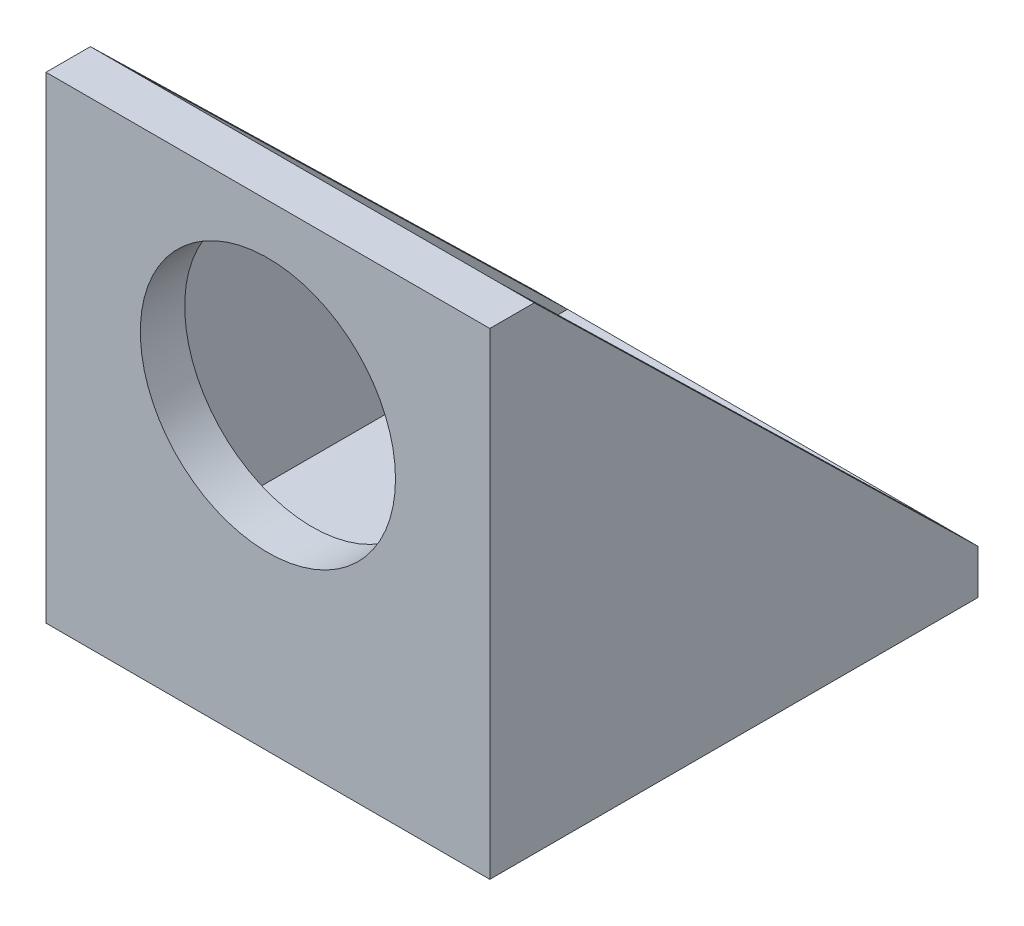
ISO-10303-21;
HEADER;
FILE_DESCRIPTION(('STEP AP214'),'2;1');
FILE_NAME('part.step','',(''),(''),'','','');
FILE_SCHEMA(('AUTOMOTIVE_DESIGN { 1 0 10303 214 1 1 1 1 }'));
ENDSEC;
DATA;
#1=APPLICATION_CONTEXT('core data for automotive mechanical design processes');
#2=APPLICATION_PROTOCOL_DEFINITION('international standard','automotive_design',2000,#1);
#3=PRODUCT_CONTEXT('',#1,'mechanical');
#4=PRODUCT('Part','Part','',(#3));
#5=PRODUCT_RELATED_PRODUCT_CATEGORY('part','',(#4));
#6=PRODUCT_DEFINITION_FORMATION('','',#4);
#7=PRODUCT_DEFINITION_CONTEXT('part definition',#1,'design');
#8=PRODUCT_DEFINITION('design','',#6,#7);
#9=PRODUCT_DEFINITION_SHAPE('','',#8);
#10=(LENGTH_UNIT() NAMED_UNIT(*) SI_UNIT(.MILLI.,.METRE.));
#11=(NAMED_UNIT(*) PLANE_ANGLE_UNIT() SI_UNIT($,.RADIAN.));
#12=(NAMED_UNIT(*) SI_UNIT($,.STERADIAN.) SOLID_ANGLE_UNIT());
#13=UNCERTAINTY_MEASURE_WITH_UNIT(LENGTH_MEASURE(1.E-05),#10,'distance_accuracy_value','');
#14=(GEOMETRIC_REPRESENTATION_CONTEXT(3) GLOBAL_UNCERTAINTY_ASSIGNED_CONTEXT((#13)) GLOBAL_UNIT_ASSIGNED_CONTEXT((#10,
#11,#12)) REPRESENTATION_CONTEXT('',''));
#15=CARTESIAN_POINT('',(0.,0.,0.));
#16=DIRECTION('',(0.,0.,1.));
#17=DIRECTION('',(1.,0.,0.));
#18=AXIS2_PLACEMENT_3D('',#15,#16,#17);
#19=CARTESIAN_POINT('',(0.,0.,0.));
#20=DIRECTION('',(0.,0.,-1.));
#21=DIRECTION('',(-1.,0.,0.));
#22=AXIS2_PLACEMENT_3D('',#19,#20,#21);
#23=PLANE('',#22);
#24=CARTESIAN_POINT('',(0.,-2.5,0.));
#25=DIRECTION('',(0.,0.,1.));
#26=DIRECTION('',(1.,0.,0.));
#27=AXIS2_PLACEMENT_3D('',#24,#25,#26);
#28=CIRCLE('',#27,11.5);
#29=CARTESIAN_POINT('',(11.5,-2.5,0.));
#30=VERTEX_POINT('',#29);
#31=EDGE_CURVE('E42',#30,#30,#28,.T.);
#32=ORIENTED_EDGE('',*,*,#31,.T.);
#33=EDGE_LOOP('',(#32));
#34=FACE_BOUND('',#33,.T.);
#35=DIRECTION('',(-1.,0.,0.));
#36=VECTOR('',#35,1.);
#37=CARTESIAN_POINT('',(17.,13.5,0.));
#38=LINE('',#37,#36);
#39=CARTESIAN_POINT('',(17.,13.5,0.));
#40=VERTEX_POINT('',#39);
#41=CARTESIAN_POINT('',(-17.,13.5,0.));
#42=VERTEX_POINT('',#41);
#43=EDGE_CURVE('E122',#40,#42,#38,.T.);
#44=ORIENTED_EDGE('',*,*,#43,.F.);
#45=DIRECTION('',(0.,1.,0.));
#46=VECTOR('',#45,1.);
#47=CARTESIAN_POINT('',(17.,13.5,0.));
#48=LINE('',#47,#46);
#49=CARTESIAN_POINT('',(17.,-25.5,0.));
#50=VERTEX_POINT('',#49);
#51=EDGE_CURVE('E170',#50,#40,#48,.T.);
#52=ORIENTED_EDGE('',*,*,#51,.F.);
#53=DIRECTION('',(1.,0.,0.));
#54=VECTOR('',#53,1.);
#55=CARTESIAN_POINT('',(20.,-25.5,0.));
#56=LINE('',#55,#54);
#57=CARTESIAN_POINT('',(-17.,-25.5,0.));
#58=VERTEX_POINT('',#57);
#59=EDGE_CURVE('E180',#58,#50,#56,.T.);
#60=ORIENTED_EDGE('',*,*,#59,.F.);
#61=DIRECTION('',(0.,-1.,0.));
#62=VECTOR('',#61,1.);
#63=CARTESIAN_POINT('',(-17.,13.5,0.));
#64=LINE('',#63,#62);
#65=EDGE_CURVE('E175',#42,#58,#64,.T.);
#66=ORIENTED_EDGE('',*,*,#65,.F.);
#67=EDGE_LOOP('',(#44,#52,#60,#66));
#68=FACE_BOUND('',#67,.T.);
#69=ADVANCED_FACE('F34',(#34,#68),#23,.T.);
#70=CARTESIAN_POINT('',(20.,-25.5,-40.));
#71=DIRECTION('',(0.,-1.,0.));
#72=DIRECTION('',(0.,0.,-1.));
#73=AXIS2_PLACEMENT_3D('',#70,#71,#72);
#74=PLANE('',#73);
#75=CARTESIAN_POINT('',(-12.5,-25.5,-8.));
#76=DIRECTION('',(0.,1.,0.));
#77=DIRECTION('',(0.,0.,1.));
#78=AXIS2_PLACEMENT_3D('',#75,#76,#77);
#79=CIRCLE('',#78,1.75);
#80=CARTESIAN_POINT('',(-12.5,-25.5,-6.25));
#81=VERTEX_POINT('',#80);
#82=EDGE_CURVE('E333',#81,#81,#79,.T.);
#83=ORIENTED_EDGE('',*,*,#82,.F.);
#84=EDGE_LOOP('',(#83));
#85=FACE_BOUND('',#84,.T.);
#86=CARTESIAN_POINT('',(12.5,-25.5,-8.));
#87=DIRECTION('',(0.,1.,0.));
#88=DIRECTION('',(0.,0.,1.));
#89=AXIS2_PLACEMENT_3D('',#86,#87,#88);
#90=CIRCLE('',#89,1.75);
#91=CARTESIAN_POINT('',(12.5,-25.5,-6.25));
#92=VERTEX_POINT('',#91);
#93=EDGE_CURVE('E334',#92,#92,#90,.T.);
#94=ORIENTED_EDGE('',*,*,#93,.F.);
#95=EDGE_LOOP('',(#94));
#96=FACE_BOUND('',#95,.T.);
#97=CARTESIAN_POINT('',(12.5,-25.5,-32.));
#98=DIRECTION('',(0.,1.,0.));
#99=DIRECTION('',(0.,0.,1.));
#100=AXIS2_PLACEMENT_3D('',#97,#98,#99);
#101=CIRCLE('',#100,1.75);
#102=CARTESIAN_POINT('',(12.5,-25.5,-30.25));
#103=VERTEX_POINT('',#102);
#104=EDGE_CURVE('E337',#103,#103,#101,.T.);
#105=ORIENTED_EDGE('',*,*,#104,.F.);
#106=EDGE_LOOP('',(#105));
#107=FACE_BOUND('',#106,.T.);
#108=CARTESIAN_POINT('',(-12.5,-25.5,-32.));
#109=DIRECTION('',(0.,1.,0.));
#110=DIRECTION('',(0.,0.,1.));
#111=AXIS2_PLACEMENT_3D('',#108,#109,#110);
#112=CIRCLE('',#111,1.75);
#113=CARTESIAN_POINT('',(-12.5,-25.5,-30.25));
#114=VERTEX_POINT('',#113);
#115=EDGE_CURVE('E155',#114,#114,#112,.T.);
#116=ORIENTED_EDGE('',*,*,#115,.F.);
#117=EDGE_LOOP('',(#116));
#118=FACE_BOUND('',#117,.T.);
#119=DIRECTION('',(0.,0.,1.));
#120=VECTOR('',#119,1.);
#121=CARTESIAN_POINT('',(17.,-25.5,-40.));
#122=LINE('',#121,#120);
#123=CARTESIAN_POINT('',(17.,-25.5,-40.));
#124=VERTEX_POINT('',#123);
#125=EDGE_CURVE('E173',#124,#50,#122,.T.);
#126=ORIENTED_EDGE('',*,*,#125,.F.);
#127=DIRECTION('',(1.,0.,0.));
#128=VECTOR('',#127,1.);
#129=CARTESIAN_POINT('',(20.,-25.5,-40.));
#130=LINE('',#129,#128);
#131=CARTESIAN_POINT('',(-17.,-25.5,-40.));
#132=VERTEX_POINT('',#131);
#133=EDGE_CURVE('E188',#132,#124,#130,.T.);
#134=ORIENTED_EDGE('',*,*,#133,.F.);
#135=DIRECTION('',(0.,0.,1.));
#136=VECTOR('',#135,1.);
#137=CARTESIAN_POINT('',(-17.,-25.5,-40.));
#138=LINE('',#137,#136);
#139=EDGE_CURVE('E177',#132,#58,#138,.T.);
#140=ORIENTED_EDGE('',*,*,#139,.T.);
#141=ORIENTED_EDGE('',*,*,#59,.T.);
#142=EDGE_LOOP('',(#126,#134,#140,#141));
#143=FACE_BOUND('',#142,.T.);
#144=ADVANCED_FACE('F207',(#85,#96,#107,#118,#143),#74,.F.);
#145=CARTESIAN_POINT('',(0.,0.,4.));
#146=DIRECTION('',(0.,0.,-1.));
#147=DIRECTION('',(-1.,0.,0.));
#148=AXIS2_PLACEMENT_3D('',#145,#146,#147);
#149=PLANE('',#148);
#150=DIRECTION('',(1.,0.,0.));
#151=VECTOR('',#150,1.);
#152=CARTESIAN_POINT('',(0.,-29.5,4.));
#153=LINE('',#152,#151);
#154=CARTESIAN_POINT('',(-20.,-29.5,4.));
#155=VERTEX_POINT('',#154);
#156=CARTESIAN_POINT('',(20.,-29.5,4.));
#157=VERTEX_POINT('',#156);
#158=EDGE_CURVE('E50',#155,#157,#153,.T.);
#159=ORIENTED_EDGE('',*,*,#158,.T.);
#160=DIRECTION('',(0.,-1.,0.));
#161=VECTOR('',#160,1.);
#162=CARTESIAN_POINT('',(20.,13.5,4.));
#163=LINE('',#162,#161);
#164=CARTESIAN_POINT('',(20.,13.5,4.));
#165=VERTEX_POINT('',#164);
#166=EDGE_CURVE('E132',#165,#157,#163,.T.);
#167=ORIENTED_EDGE('',*,*,#166,.F.);
#168=DIRECTION('',(1.,0.,0.));
#169=VECTOR('',#168,1.);
#170=CARTESIAN_POINT('',(-17.,13.5,4.));
#171=LINE('',#170,#169);
#172=CARTESIAN_POINT('',(-20.,13.5,4.));
#173=VERTEX_POINT('',#172);
#174=EDGE_CURVE('E143',#173,#165,#171,.T.);
#175=ORIENTED_EDGE('',*,*,#174,.F.);
#176=DIRECTION('',(0.,1.,0.));
#177=VECTOR('',#176,1.);
#178=CARTESIAN_POINT('',(-20.,-29.5,4.));
#179=LINE('',#178,#177);
#180=EDGE_CURVE('E130',#155,#173,#179,.T.);
#181=ORIENTED_EDGE('',*,*,#180,.F.);
#182=EDGE_LOOP('',(#159,#167,#175,#181));
#183=FACE_BOUND('',#182,.T.);
#184=CARTESIAN_POINT('',(0.,-2.5,4.));
#185=DIRECTION('',(0.,0.,1.));
#186=DIRECTION('',(1.,0.,0.));
#187=AXIS2_PLACEMENT_3D('',#184,#185,#186);
#188=CIRCLE('',#187,11.5);
#189=CARTESIAN_POINT('',(11.5,-2.5,4.));
#190=VERTEX_POINT('',#189);
#191=EDGE_CURVE('E146',#190,#190,#188,.T.);
#192=ORIENTED_EDGE('',*,*,#191,.F.);
#193=EDGE_LOOP('',(#192));
#194=FACE_BOUND('',#193,.T.);
#195=ADVANCED_FACE('F194',(#183,#194),#149,.F.);
#196=CARTESIAN_POINT('',(0.,-2.5,0.));
#197=DIRECTION('',(0.,0.,1.));
#198=DIRECTION('',(1.,0.,0.));
#199=AXIS2_PLACEMENT_3D('',#196,#197,#198);
#200=CYLINDRICAL_SURFACE('',#199,11.5);
#201=ORIENTED_EDGE('',*,*,#31,.F.);
#202=EDGE_LOOP('',(#201));
#203=FACE_BOUND('',#202,.T.);
#204=ORIENTED_EDGE('',*,*,#191,.T.);
#205=EDGE_LOOP('',(#204));
#206=FACE_BOUND('',#205,.T.);
#207=ADVANCED_FACE('F234',(#203,#206),#200,.F.);
#208=CARTESIAN_POINT('',(0.,-29.5,0.));
#209=DIRECTION('',(0.,-1.,0.));
#210=DIRECTION('',(0.,0.,-1.));
#211=AXIS2_PLACEMENT_3D('',#208,#209,#210);
#212=PLANE('',#211);
#213=CARTESIAN_POINT('',(-12.5,-29.5,-8.));
#214=DIRECTION('',(0.,-1.,0.));
#215=DIRECTION('',(0.,0.,-1.));
#216=AXIS2_PLACEMENT_3D('',#213,#214,#215);
#217=CIRCLE('',#216,1.75);
#218=CARTESIAN_POINT('',(-12.5,-29.5,-9.75));
#219=VERTEX_POINT('',#218);
#220=EDGE_CURVE('E37',#219,#219,#217,.T.);
#221=ORIENTED_EDGE('',*,*,#220,.F.);
#222=EDGE_LOOP('',(#221));
#223=FACE_BOUND('',#222,.T.);
#224=CARTESIAN_POINT('',(12.5,-29.5,-8.));
#225=DIRECTION('',(0.,-1.,0.));
#226=DIRECTION('',(0.,0.,-1.));
#227=AXIS2_PLACEMENT_3D('',#224,#225,#226);
#228=CIRCLE('',#227,1.75);
#229=CARTESIAN_POINT('',(12.5,-29.5,-9.75));
#230=VERTEX_POINT('',#229);
#231=EDGE_CURVE('E157',#230,#230,#228,.T.);
#232=ORIENTED_EDGE('',*,*,#231,.F.);
#233=EDGE_LOOP('',(#232));
#234=FACE_BOUND('',#233,.T.);
#235=CARTESIAN_POINT('',(12.5,-29.5,-32.));
#236=DIRECTION('',(0.,-1.,0.));
#237=DIRECTION('',(0.,0.,-1.));
#238=AXIS2_PLACEMENT_3D('',#235,#236,#237);
#239=CIRCLE('',#238,1.75);
#240=CARTESIAN_POINT('',(12.5,-29.5,-33.75));
#241=VERTEX_POINT('',#240);
#242=EDGE_CURVE('E154',#241,#241,#239,.T.);
#243=ORIENTED_EDGE('',*,*,#242,.F.);
#244=EDGE_LOOP('',(#243));
#245=FACE_BOUND('',#244,.T.);
#246=CARTESIAN_POINT('',(-12.5,-29.5,-32.));
#247=DIRECTION('',(0.,-1.,0.));
#248=DIRECTION('',(0.,0.,-1.));
#249=AXIS2_PLACEMENT_3D('',#246,#247,#248);
#250=CIRCLE('',#249,1.75);
#251=CARTESIAN_POINT('',(-12.5,-29.5,-33.75));
#252=VERTEX_POINT('',#251);
#253=EDGE_CURVE('E151',#252,#252,#250,.T.);
#254=ORIENTED_EDGE('',*,*,#253,.F.);
#255=EDGE_LOOP('',(#254));
#256=FACE_BOUND('',#255,.T.);
#257=ORIENTED_EDGE('',*,*,#158,.F.);
#258=DIRECTION('',(0.,0.,1.));
#259=VECTOR('',#258,1.);
#260=CARTESIAN_POINT('',(-20.,-29.5,0.));
#261=LINE('',#260,#259);
#262=CARTESIAN_POINT('',(-20.,-29.5,-40.));
#263=VERTEX_POINT('',#262);
#264=EDGE_CURVE('E134',#263,#155,#261,.T.);
#265=ORIENTED_EDGE('',*,*,#264,.F.);
#266=DIRECTION('',(-1.,0.,0.));
#267=VECTOR('',#266,1.);
#268=CARTESIAN_POINT('',(20.,-29.5,-40.));
#269=LINE('',#268,#267);
#270=CARTESIAN_POINT('',(20.,-29.5,-40.));
#271=VERTEX_POINT('',#270);
#272=EDGE_CURVE('E183',#271,#263,#269,.T.);
#273=ORIENTED_EDGE('',*,*,#272,.F.);
#274=DIRECTION('',(0.,0.,-1.));
#275=VECTOR('',#274,1.);
#276=CARTESIAN_POINT('',(20.,-29.5,4.));
#277=LINE('',#276,#275);
#278=EDGE_CURVE('E139',#157,#271,#277,.T.);
#279=ORIENTED_EDGE('',*,*,#278,.F.);
#280=EDGE_LOOP('',(#257,#265,#273,#279));
#281=FACE_BOUND('',#280,.T.);
#282=ADVANCED_FACE('F213',(#223,#234,#245,#256,#281),#212,.T.);
#283=CARTESIAN_POINT('',(0.,13.5,0.));
#284=DIRECTION('',(0.,1.,0.));
#285=DIRECTION('',(0.,0.,1.));
#286=AXIS2_PLACEMENT_3D('',#283,#284,#285);
#287=PLANE('',#286);
#288=DIRECTION('',(1.,0.,0.));
#289=VECTOR('',#288,1.);
#290=CARTESIAN_POINT('',(-89.5,13.5,0.));
#291=LINE('',#290,#289);
#292=CARTESIAN_POINT('',(-20.,13.5,0.));
#293=VERTEX_POINT('',#292);
#294=EDGE_CURVE('E104',#293,#42,#291,.T.);
#295=ORIENTED_EDGE('',*,*,#294,.F.);
#296=DIRECTION('',(0.,0.,-1.));
#297=VECTOR('',#296,1.);
#298=CARTESIAN_POINT('',(-20.,13.5,4.));
#299=LINE('',#298,#297);
#300=EDGE_CURVE('E119',#173,#293,#299,.T.);
#301=ORIENTED_EDGE('',*,*,#300,.F.);
#302=ORIENTED_EDGE('',*,*,#174,.T.);
#303=DIRECTION('',(0.,0.,1.));
#304=VECTOR('',#303,1.);
#305=CARTESIAN_POINT('',(20.,13.5,0.));
#306=LINE('',#305,#304);
#307=CARTESIAN_POINT('',(20.,13.5,0.));
#308=VERTEX_POINT('',#307);
#309=EDGE_CURVE('E57',#308,#165,#306,.T.);
#310=ORIENTED_EDGE('',*,*,#309,.F.);
#311=EDGE_CURVE('E125',#40,#308,#291,.T.);
#312=ORIENTED_EDGE('',*,*,#311,.F.);
#313=ORIENTED_EDGE('',*,*,#43,.T.);
#314=EDGE_LOOP('',(#295,#301,#302,#310,#312,#313));
#315=FACE_BOUND('',#314,.T.);
#316=ADVANCED_FACE('F118',(#315),#287,.T.);
#317=CARTESIAN_POINT('',(20.,0.,0.));
#318=DIRECTION('',(1.,0.,0.));
#319=DIRECTION('',(0.,0.,-1.));
#320=AXIS2_PLACEMENT_3D('',#317,#318,#319);
#321=PLANE('',#320);
#322=DIRECTION('',(0.,-0.69810013612954,-0.716000139620041));
#323=VECTOR('',#322,1.);
#324=CARTESIAN_POINT('',(20.,6.92085869913489,-6.74783723165652));
#325=LINE('',#324,#323);
#326=CARTESIAN_POINT('',(20.,-25.5,-40.));
#327=VERTEX_POINT('',#326);
#328=EDGE_CURVE('E112',#308,#327,#325,.T.);
#329=ORIENTED_EDGE('',*,*,#328,.F.);
#330=ORIENTED_EDGE('',*,*,#309,.T.);
#331=ORIENTED_EDGE('',*,*,#166,.T.);
#332=ORIENTED_EDGE('',*,*,#278,.T.);
#333=DIRECTION('',(0.,-1.,0.));
#334=VECTOR('',#333,1.);
#335=CARTESIAN_POINT('',(20.,-29.5,-40.));
#336=LINE('',#335,#334);
#337=EDGE_CURVE('E181',#327,#271,#336,.T.);
#338=ORIENTED_EDGE('',*,*,#337,.F.);
#339=EDGE_LOOP('',(#329,#330,#331,#332,#338));
#340=FACE_BOUND('',#339,.T.);
#341=ADVANCED_FACE('F214',(#340),#321,.T.);
#342=CARTESIAN_POINT('',(-20.,0.,0.));
#343=DIRECTION('',(-1.,0.,0.));
#344=DIRECTION('',(0.,0.,1.));
#345=AXIS2_PLACEMENT_3D('',#342,#343,#344);
#346=PLANE('',#345);
#347=DIRECTION('',(0.,0.69810013612954,0.716000139620041));
#348=VECTOR('',#347,1.);
#349=CARTESIAN_POINT('',(-20.,6.92085869913489,-6.74783723165652));
#350=LINE('',#349,#348);
#351=CARTESIAN_POINT('',(-20.,-25.5,-40.));
#352=VERTEX_POINT('',#351);
#353=EDGE_CURVE('E101',#352,#293,#350,.T.);
#354=ORIENTED_EDGE('',*,*,#353,.F.);
#355=DIRECTION('',(0.,1.,0.));
#356=VECTOR('',#355,1.);
#357=CARTESIAN_POINT('',(-20.,-29.5,-40.));
#358=LINE('',#357,#356);
#359=EDGE_CURVE('E186',#263,#352,#358,.T.);
#360=ORIENTED_EDGE('',*,*,#359,.F.);
#361=ORIENTED_EDGE('',*,*,#264,.T.);
#362=ORIENTED_EDGE('',*,*,#180,.T.);
#363=ORIENTED_EDGE('',*,*,#300,.T.);
#364=EDGE_LOOP('',(#354,#360,#361,#362,#363));
#365=FACE_BOUND('',#364,.T.);
#366=ADVANCED_FACE('F128',(#365),#346,.T.);
#367=CARTESIAN_POINT('',(0.,0.,-40.));
#368=DIRECTION('',(0.,0.,1.));
#369=DIRECTION('',(1.,0.,0.));
#370=AXIS2_PLACEMENT_3D('',#367,#368,#369);
#371=PLANE('',#370);
#372=ORIENTED_EDGE('',*,*,#359,.T.);
#373=DIRECTION('',(1.,0.,0.));
#374=VECTOR('',#373,1.);
#375=CARTESIAN_POINT('',(-89.5,-25.5,-40.));
#376=LINE('',#375,#374);
#377=EDGE_CURVE('E107',#352,#132,#376,.T.);
#378=ORIENTED_EDGE('',*,*,#377,.T.);
#379=ORIENTED_EDGE('',*,*,#133,.T.);
#380=EDGE_CURVE('E124',#124,#327,#376,.T.);
#381=ORIENTED_EDGE('',*,*,#380,.T.);
#382=ORIENTED_EDGE('',*,*,#337,.T.);
#383=ORIENTED_EDGE('',*,*,#272,.T.);
#384=EDGE_LOOP('',(#372,#378,#379,#381,#382,#383));
#385=FACE_BOUND('',#384,.T.);
#386=ADVANCED_FACE('F210',(#385),#371,.F.);
#387=CARTESIAN_POINT('',(-17.,13.5,-40.));
#388=DIRECTION('',(-1.,0.,0.));
#389=DIRECTION('',(0.,0.,1.));
#390=AXIS2_PLACEMENT_3D('',#387,#388,#389);
#391=PLANE('',#390);
#392=ORIENTED_EDGE('',*,*,#139,.F.);
#393=DIRECTION('',(0.,0.69810013612954,0.716000139620041));
#394=VECTOR('',#393,1.);
#395=CARTESIAN_POINT('',(-17.,-6.4935917975008,-20.5062479974367));
#396=LINE('',#395,#394);
#397=EDGE_CURVE('E113',#132,#42,#396,.T.);
#398=ORIENTED_EDGE('',*,*,#397,.T.);
#399=ORIENTED_EDGE('',*,*,#65,.T.);
#400=EDGE_LOOP('',(#392,#398,#399));
#401=FACE_BOUND('',#400,.T.);
#402=ADVANCED_FACE('F204',(#401),#391,.F.);
#403=CARTESIAN_POINT('',(17.,13.5,-40.));
#404=DIRECTION('',(1.,0.,0.));
#405=DIRECTION('',(0.,0.,-1.));
#406=AXIS2_PLACEMENT_3D('',#403,#404,#405);
#407=PLANE('',#406);
#408=ORIENTED_EDGE('',*,*,#51,.T.);
#409=DIRECTION('',(0.,-0.69810013612954,-0.716000139620041));
#410=VECTOR('',#409,1.);
#411=CARTESIAN_POINT('',(17.,-6.4935917975008,-20.5062479974367));
#412=LINE('',#411,#410);
#413=EDGE_CURVE('E11',#40,#124,#412,.T.);
#414=ORIENTED_EDGE('',*,*,#413,.T.);
#415=ORIENTED_EDGE('',*,*,#125,.T.);
#416=EDGE_LOOP('',(#408,#414,#415));
#417=FACE_BOUND('',#416,.T.);
#418=ADVANCED_FACE('F198',(#417),#407,.F.);
#419=CARTESIAN_POINT('',(-89.5,13.5,0.));
#420=DIRECTION('',(0.,-0.716000139620041,0.69810013612954));
#421=DIRECTION('',(0.,-0.69810013612954,-0.716000139620041));
#422=AXIS2_PLACEMENT_3D('',#419,#420,#421);
#423=PLANE('',#422);
#424=ORIENTED_EDGE('',*,*,#328,.T.);
#425=ORIENTED_EDGE('',*,*,#380,.F.);
#426=ORIENTED_EDGE('',*,*,#413,.F.);
#427=ORIENTED_EDGE('',*,*,#311,.T.);
#428=EDGE_LOOP('',(#424,#425,#426,#427));
#429=FACE_BOUND('',#428,.T.);
#430=ADVANCED_FACE('F215',(#429),#423,.F.);
#431=ORIENTED_EDGE('',*,*,#353,.T.);
#432=ORIENTED_EDGE('',*,*,#294,.T.);
#433=ORIENTED_EDGE('',*,*,#397,.F.);
#434=ORIENTED_EDGE('',*,*,#377,.F.);
#435=EDGE_LOOP('',(#431,#432,#433,#434));
#436=FACE_BOUND('',#435,.T.);
#437=ADVANCED_FACE('F103',(#436),#423,.F.);
#438=CARTESIAN_POINT('',(-12.5,-30.5,-32.));
#439=DIRECTION('',(0.,1.,0.));
#440=DIRECTION('',(0.,0.,1.));
#441=AXIS2_PLACEMENT_3D('',#438,#439,#440);
#442=CYLINDRICAL_SURFACE('',#441,1.75);
#443=ORIENTED_EDGE('',*,*,#253,.T.);
#444=EDGE_LOOP('',(#443));
#445=FACE_BOUND('',#444,.T.);
#446=ORIENTED_EDGE('',*,*,#115,.T.);
#447=EDGE_LOOP('',(#446));
#448=FACE_BOUND('',#447,.T.);
#449=ADVANCED_FACE('F222',(#445,#448),#442,.F.);
#450=CARTESIAN_POINT('',(12.5,-30.5,-32.));
#451=DIRECTION('',(0.,1.,0.));
#452=DIRECTION('',(0.,0.,1.));
#453=AXIS2_PLACEMENT_3D('',#450,#451,#452);
#454=CYLINDRICAL_SURFACE('',#453,1.75);
#455=ORIENTED_EDGE('',*,*,#242,.T.);
#456=EDGE_LOOP('',(#455));
#457=FACE_BOUND('',#456,.T.);
#458=ORIENTED_EDGE('',*,*,#104,.T.);
#459=EDGE_LOOP('',(#458));
#460=FACE_BOUND('',#459,.T.);
#461=ADVANCED_FACE('F299',(#457,#460),#454,.F.);
#462=CARTESIAN_POINT('',(12.5,-30.5,-8.));
#463=DIRECTION('',(0.,1.,0.));
#464=DIRECTION('',(0.,0.,1.));
#465=AXIS2_PLACEMENT_3D('',#462,#463,#464);
#466=CYLINDRICAL_SURFACE('',#465,1.75);
#467=ORIENTED_EDGE('',*,*,#231,.T.);
#468=EDGE_LOOP('',(#467));
#469=FACE_BOUND('',#468,.T.);
#470=ORIENTED_EDGE('',*,*,#93,.T.);
#471=EDGE_LOOP('',(#470));
#472=FACE_BOUND('',#471,.T.);
#473=ADVANCED_FACE('F308',(#469,#472),#466,.F.);
#474=CARTESIAN_POINT('',(-12.5,-30.5,-8.));
#475=DIRECTION('',(0.,1.,0.));
#476=DIRECTION('',(0.,0.,1.));
#477=AXIS2_PLACEMENT_3D('',#474,#475,#476);
#478=CYLINDRICAL_SURFACE('',#477,1.75);
#479=ORIENTED_EDGE('',*,*,#220,.T.);
#480=EDGE_LOOP('',(#479));
#481=FACE_BOUND('',#480,.T.);
#482=ORIENTED_EDGE('',*,*,#82,.T.);
#483=EDGE_LOOP('',(#482));
#484=FACE_BOUND('',#483,.T.);
#485=ADVANCED_FACE('F318',(#481,#484),#478,.F.);
#486=CLOSED_SHELL('',(#69,#144,#195,#207,#282,#316,#341,#366,#386,#402,#418,#430,#437,#449,#461,
#473,#485));
#487=MANIFOLD_SOLID_BREP('B2',#486);
#488=ADVANCED_BREP_SHAPE_REPRESENTATION('',(#18,#487),#14);
#489=SHAPE_DEFINITION_REPRESENTATION(#9,#488);
ENDSEC;
END-ISO-10303-21;
